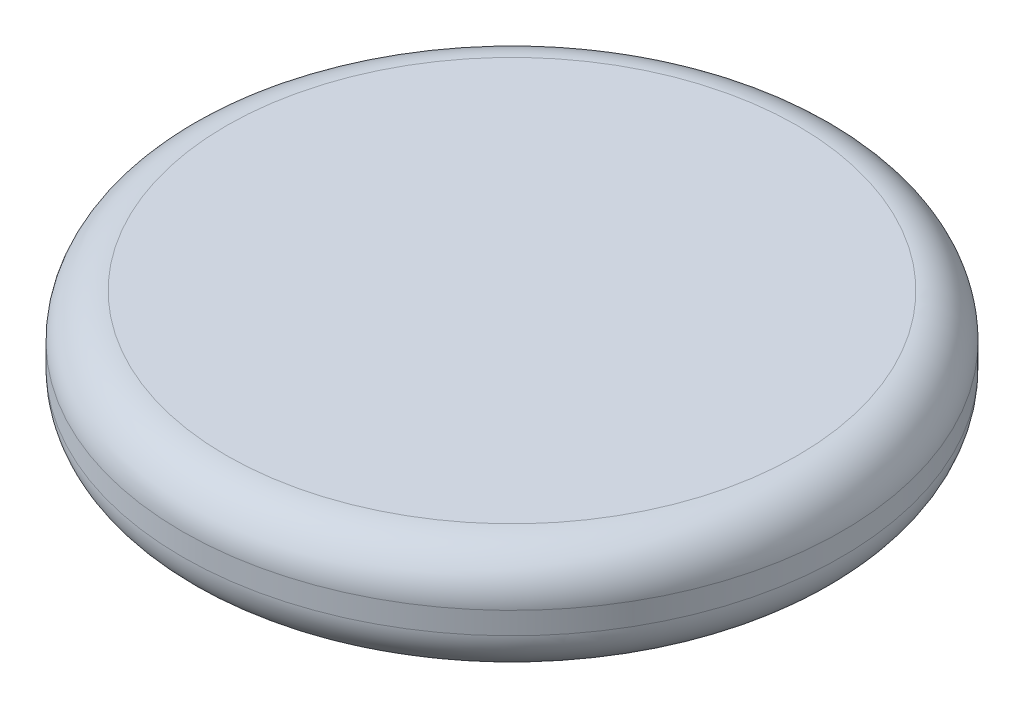
ISO-10303-21;
HEADER;
FILE_DESCRIPTION(('STEP AP214'),'2;1');
FILE_NAME('part.step','',(''),(''),'','','');
FILE_SCHEMA(('AUTOMOTIVE_DESIGN { 1 0 10303 214 1 1 1 1 }'));
ENDSEC;
DATA;
#1=APPLICATION_CONTEXT('core data for automotive mechanical design processes');
#2=APPLICATION_PROTOCOL_DEFINITION('international standard','automotive_design',2000,#1);
#3=PRODUCT_CONTEXT('',#1,'mechanical');
#4=PRODUCT('Part','Part','',(#3));
#5=PRODUCT_RELATED_PRODUCT_CATEGORY('part','',(#4));
#6=PRODUCT_DEFINITION_FORMATION('','',#4);
#7=PRODUCT_DEFINITION_CONTEXT('part definition',#1,'design');
#8=PRODUCT_DEFINITION('design','',#6,#7);
#9=PRODUCT_DEFINITION_SHAPE('','',#8);
#10=(LENGTH_UNIT() NAMED_UNIT(*) SI_UNIT(.MILLI.,.METRE.));
#11=(NAMED_UNIT(*) PLANE_ANGLE_UNIT() SI_UNIT($,.RADIAN.));
#12=(NAMED_UNIT(*) SI_UNIT($,.STERADIAN.) SOLID_ANGLE_UNIT());
#13=UNCERTAINTY_MEASURE_WITH_UNIT(LENGTH_MEASURE(1.E-05),#10,'distance_accuracy_value','');
#14=(GEOMETRIC_REPRESENTATION_CONTEXT(3) GLOBAL_UNCERTAINTY_ASSIGNED_CONTEXT((#13)) GLOBAL_UNIT_ASSIGNED_CONTEXT((#10,
#11,#12)) REPRESENTATION_CONTEXT('',''));
#15=CARTESIAN_POINT('',(0.,0.,0.));
#16=DIRECTION('',(0.,0.,1.));
#17=DIRECTION('',(1.,0.,0.));
#18=AXIS2_PLACEMENT_3D('',#15,#16,#17);
#19=CARTESIAN_POINT('',(0.,8.33333333333333,0.));
#20=DIRECTION('',(0.,-1.,0.));
#21=DIRECTION('',(0.,0.,-1.));
#22=AXIS2_PLACEMENT_3D('',#19,#20,#21);
#23=CYLINDRICAL_SURFACE('',#22,25.);
#24=CARTESIAN_POINT('',(0.,3.33333333333333,0.));
#25=DIRECTION('',(0.,1.,0.));
#26=DIRECTION('',(0.,0.,1.));
#27=AXIS2_PLACEMENT_3D('',#24,#25,#26);
#28=CIRCLE('',#27,25.);
#29=CARTESIAN_POINT('',(0.,3.33333333333333,25.));
#30=VERTEX_POINT('',#29);
#31=EDGE_CURVE('E42',#30,#30,#28,.T.);
#32=ORIENTED_EDGE('',*,*,#31,.T.);
#33=EDGE_LOOP('',(#32));
#34=FACE_BOUND('',#33,.T.);
#35=CARTESIAN_POINT('',(0.,5.,0.));
#36=DIRECTION('',(0.,1.,0.));
#37=DIRECTION('',(0.,0.,1.));
#38=AXIS2_PLACEMENT_3D('',#35,#36,#37);
#39=CIRCLE('',#38,25.);
#40=CARTESIAN_POINT('',(0.,5.,25.));
#41=VERTEX_POINT('',#40);
#42=EDGE_CURVE('E46',#41,#41,#39,.F.);
#43=ORIENTED_EDGE('',*,*,#42,.T.);
#44=EDGE_LOOP('',(#43));
#45=FACE_BOUND('',#44,.T.);
#46=ADVANCED_FACE('F31',(#34,#45),#23,.T.);
#47=CARTESIAN_POINT('',(0.,8.33333333333333,0.));
#48=DIRECTION('',(0.,1.,0.));
#49=DIRECTION('',(0.,0.,1.));
#50=AXIS2_PLACEMENT_3D('',#47,#48,#49);
#51=PLANE('',#50);
#52=CARTESIAN_POINT('',(0.,8.33333333333333,0.));
#53=DIRECTION('',(0.,1.,0.));
#54=DIRECTION('',(0.,0.,1.));
#55=AXIS2_PLACEMENT_3D('',#52,#53,#54);
#56=CIRCLE('',#55,21.6666666666667);
#57=CARTESIAN_POINT('',(0.,8.33333333333333,21.6666666666667));
#58=VERTEX_POINT('',#57);
#59=EDGE_CURVE('E10',#58,#58,#56,.T.);
#60=ORIENTED_EDGE('',*,*,#59,.T.);
#61=EDGE_LOOP('',(#60));
#62=FACE_BOUND('',#61,.T.);
#63=ADVANCED_FACE('F62',(#62),#51,.T.);
#64=CARTESIAN_POINT('',(0.,0.,0.));
#65=DIRECTION('',(0.,1.,0.));
#66=DIRECTION('',(0.,0.,1.));
#67=AXIS2_PLACEMENT_3D('',#64,#65,#66);
#68=PLANE('',#67);
#69=CARTESIAN_POINT('',(0.,0.,0.));
#70=DIRECTION('',(0.,1.,0.));
#71=DIRECTION('',(0.,0.,1.));
#72=AXIS2_PLACEMENT_3D('',#69,#70,#71);
#73=CIRCLE('',#72,21.6666666666667);
#74=CARTESIAN_POINT('',(0.,0.,21.6666666666667));
#75=VERTEX_POINT('',#74);
#76=EDGE_CURVE('E38',#75,#75,#73,.F.);
#77=ORIENTED_EDGE('',*,*,#76,.T.);
#78=EDGE_LOOP('',(#77));
#79=FACE_BOUND('',#78,.T.);
#80=ADVANCED_FACE('F59',(#79),#68,.F.);
#81=CARTESIAN_POINT('',(0.,3.33333333333333,0.));
#82=DIRECTION('',(0.,1.,0.));
#83=DIRECTION('',(0.,0.,1.));
#84=AXIS2_PLACEMENT_3D('',#81,#82,#83);
#85=TOROIDAL_SURFACE('',#84,21.6666666666667,3.33333333333333);
#86=ORIENTED_EDGE('',*,*,#76,.F.);
#87=EDGE_LOOP('',(#86));
#88=FACE_BOUND('',#87,.T.);
#89=ORIENTED_EDGE('',*,*,#31,.F.);
#90=EDGE_LOOP('',(#89));
#91=FACE_BOUND('',#90,.T.);
#92=ADVANCED_FACE('F55',(#88,#91),#85,.T.);
#93=CARTESIAN_POINT('',(0.,5.,0.));
#94=DIRECTION('',(0.,1.,0.));
#95=DIRECTION('',(0.,0.,1.));
#96=AXIS2_PLACEMENT_3D('',#93,#94,#95);
#97=TOROIDAL_SURFACE('',#96,21.6666666666667,3.33333333333333);
#98=ORIENTED_EDGE('',*,*,#42,.F.);
#99=EDGE_LOOP('',(#98));
#100=FACE_BOUND('',#99,.T.);
#101=ORIENTED_EDGE('',*,*,#59,.F.);
#102=EDGE_LOOP('',(#101));
#103=FACE_BOUND('',#102,.T.);
#104=ADVANCED_FACE('F33',(#100,#103),#97,.T.);
#105=CLOSED_SHELL('',(#46,#63,#80,#92,#104));
#106=MANIFOLD_SOLID_BREP('B2',#105);
#107=ADVANCED_BREP_SHAPE_REPRESENTATION('',(#18,#106),#14);
#108=SHAPE_DEFINITION_REPRESENTATION(#9,#107);
ENDSEC;
END-ISO-10303-21;
